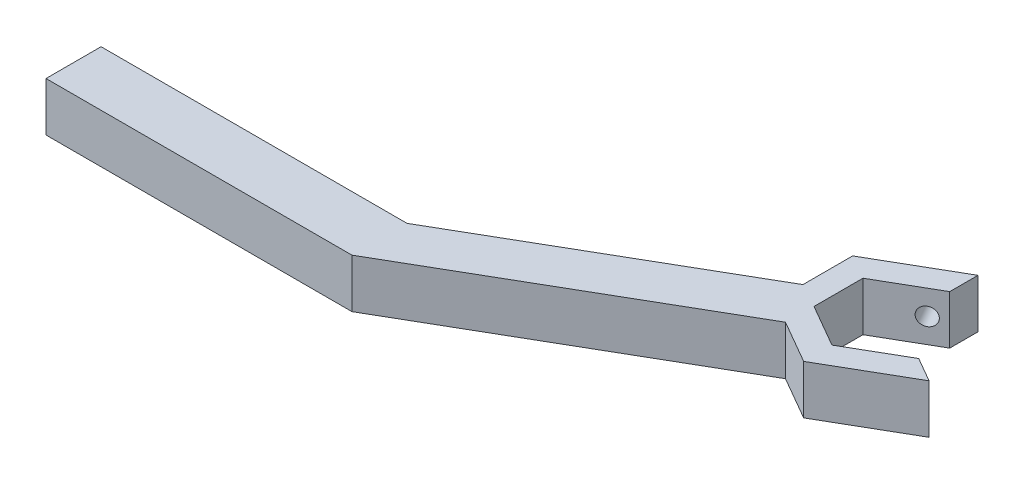
ISO-10303-21;
HEADER;
FILE_DESCRIPTION(('STEP AP214'),'2;1');
FILE_NAME('part.step','',(''),(''),'','','');
FILE_SCHEMA(('AUTOMOTIVE_DESIGN { 1 0 10303 214 1 1 1 1 }'));
ENDSEC;
DATA;
#1=APPLICATION_CONTEXT('core data for automotive mechanical design processes');
#2=APPLICATION_PROTOCOL_DEFINITION('international standard','automotive_design',2000,#1);
#3=PRODUCT_CONTEXT('',#1,'mechanical');
#4=PRODUCT('Part','Part','',(#3));
#5=PRODUCT_RELATED_PRODUCT_CATEGORY('part','',(#4));
#6=PRODUCT_DEFINITION_FORMATION('','',#4);
#7=PRODUCT_DEFINITION_CONTEXT('part definition',#1,'design');
#8=PRODUCT_DEFINITION('design','',#6,#7);
#9=PRODUCT_DEFINITION_SHAPE('','',#8);
#10=(LENGTH_UNIT() NAMED_UNIT(*) SI_UNIT(.MILLI.,.METRE.));
#11=(NAMED_UNIT(*) PLANE_ANGLE_UNIT() SI_UNIT($,.RADIAN.));
#12=(NAMED_UNIT(*) SI_UNIT($,.STERADIAN.) SOLID_ANGLE_UNIT());
#13=UNCERTAINTY_MEASURE_WITH_UNIT(LENGTH_MEASURE(1.E-05),#10,'distance_accuracy_value','');
#14=(GEOMETRIC_REPRESENTATION_CONTEXT(3) GLOBAL_UNCERTAINTY_ASSIGNED_CONTEXT((#13)) GLOBAL_UNIT_ASSIGNED_CONTEXT((#10,
#11,#12)) REPRESENTATION_CONTEXT('',''));
#15=CARTESIAN_POINT('',(0.,0.,0.));
#16=DIRECTION('',(0.,0.,1.));
#17=DIRECTION('',(1.,0.,0.));
#18=AXIS2_PLACEMENT_3D('',#15,#16,#17);
#19=CARTESIAN_POINT('',(5.91089838486212,4.,10.2379763209581));
#20=DIRECTION('',(-0.499999999999996,0.,-0.866025403784441));
#21=DIRECTION('',(-0.866025403784441,0.,0.499999999999996));
#22=AXIS2_PLACEMENT_3D('',#19,#20,#21);
#23=PLANE('',#22);
#24=CARTESIAN_POINT('',(95.1806079660839,4.,-41.3019145362394));
#25=DIRECTION('',(-0.499999999999996,0.,-0.866025403784441));
#26=DIRECTION('',(-0.866025403784441,0.,0.499999999999996));
#27=AXIS2_PLACEMENT_3D('',#24,#25,#26);
#28=CIRCLE('',#27,1.45);
#29=CARTESIAN_POINT('',(93.9248711305965,4.,-40.5769145362394));
#30=VERTEX_POINT('',#29);
#31=EDGE_CURVE('E177',#30,#30,#28,.T.);
#32=ORIENTED_EDGE('',*,*,#31,.F.);
#33=EDGE_LOOP('',(#32));
#34=FACE_BOUND('',#33,.T.);
#35=DIRECTION('',(0.866025403784441,0.,-0.499999999999996));
#36=VECTOR('',#35,1.);
#37=CARTESIAN_POINT('',(5.91089838486212,0.,10.2379763209581));
#38=LINE('',#37,#36);
#39=CARTESIAN_POINT('',(86.5203539282395,0.,-36.3019145362394));
#40=VERTEX_POINT('',#39);
#41=CARTESIAN_POINT('',(99.5107349850061,0.,-43.8019145362394));
#42=VERTEX_POINT('',#41);
#43=EDGE_CURVE('E232',#40,#42,#38,.T.);
#44=ORIENTED_EDGE('',*,*,#43,.F.);
#45=DIRECTION('',(0.,-1.,0.));
#46=VECTOR('',#45,1.);
#47=CARTESIAN_POINT('',(86.5203539282395,4.,-36.3019145362394));
#48=LINE('',#47,#46);
#49=CARTESIAN_POINT('',(86.5203539282395,8.,-36.3019145362394));
#50=VERTEX_POINT('',#49);
#51=EDGE_CURVE('E11',#50,#40,#48,.T.);
#52=ORIENTED_EDGE('',*,*,#51,.F.);
#53=DIRECTION('',(-0.866025403784441,0.,0.499999999999996));
#54=VECTOR('',#53,1.);
#55=CARTESIAN_POINT('',(5.91089838486212,8.,10.2379763209581));
#56=LINE('',#55,#54);
#57=CARTESIAN_POINT('',(99.5107349850061,8.,-43.8019145362394));
#58=VERTEX_POINT('',#57);
#59=EDGE_CURVE('E160',#58,#50,#56,.T.);
#60=ORIENTED_EDGE('',*,*,#59,.F.);
#61=DIRECTION('',(0.,-1.,0.));
#62=VECTOR('',#61,1.);
#63=CARTESIAN_POINT('',(99.5107349850061,4.,-43.8019145362394));
#64=LINE('',#63,#62);
#65=EDGE_CURVE('E61',#58,#42,#64,.T.);
#66=ORIENTED_EDGE('',*,*,#65,.T.);
#67=EDGE_LOOP('',(#44,#52,#60,#66));
#68=FACE_BOUND('',#67,.T.);
#69=ADVANCED_FACE('F46',(#34,#68),#23,.T.);
#70=CARTESIAN_POINT('',(86.5203539282393,4.,4.75762714347043E-13));
#71=DIRECTION('',(1.,0.,0.));
#72=DIRECTION('',(0.,0.,-1.));
#73=AXIS2_PLACEMENT_3D('',#70,#71,#72);
#74=PLANE('',#73);
#75=DIRECTION('',(0.,0.,1.));
#76=VECTOR('',#75,1.);
#77=CARTESIAN_POINT('',(86.5203539282393,0.,4.75762714347043E-13));
#78=LINE('',#77,#76);
#79=CARTESIAN_POINT('',(86.5203539282395,0.,-28.1831123827225));
#80=VERTEX_POINT('',#79);
#81=EDGE_CURVE('E235',#40,#80,#78,.T.);
#82=ORIENTED_EDGE('',*,*,#81,.T.);
#83=DIRECTION('',(0.,-1.,0.));
#84=VECTOR('',#83,1.);
#85=CARTESIAN_POINT('',(86.5203539282395,4.,-28.1831123827225));
#86=LINE('',#85,#84);
#87=CARTESIAN_POINT('',(86.5203539282395,8.,-28.1831123827225));
#88=VERTEX_POINT('',#87);
#89=EDGE_CURVE('E54',#88,#80,#86,.T.);
#90=ORIENTED_EDGE('',*,*,#89,.F.);
#91=DIRECTION('',(0.,0.,-1.));
#92=VECTOR('',#91,1.);
#93=CARTESIAN_POINT('',(86.5203539282393,8.,4.75762714347043E-13));
#94=LINE('',#93,#92);
#95=EDGE_CURVE('E165',#88,#50,#94,.T.);
#96=ORIENTED_EDGE('',*,*,#95,.T.);
#97=ORIENTED_EDGE('',*,*,#51,.T.);
#98=EDGE_LOOP('',(#82,#90,#96,#97));
#99=FACE_BOUND('',#98,.T.);
#100=ADVANCED_FACE('F342',(#99),#74,.F.);
#101=CARTESIAN_POINT('',(9.42644284148479,4.,16.3270779360958));
#102=DIRECTION('',(0.499999999999995,0.,0.866025403784442));
#103=DIRECTION('',(0.866025403784442,0.,-0.499999999999995));
#104=AXIS2_PLACEMENT_3D('',#101,#102,#103);
#105=PLANE('',#104);
#106=DIRECTION('',(-0.866025403784442,0.,0.499999999999995));
#107=VECTOR('',#106,1.);
#108=CARTESIAN_POINT('',(9.42644284148479,0.,16.3270779360958));
#109=LINE('',#108,#107);
#110=CARTESIAN_POINT('',(45.5,0.,-4.5));
#111=VERTEX_POINT('',#110);
#112=EDGE_CURVE('E238',#80,#111,#109,.T.);
#113=ORIENTED_EDGE('',*,*,#112,.T.);
#114=DIRECTION('',(0.,-1.,0.));
#115=VECTOR('',#114,1.);
#116=CARTESIAN_POINT('',(45.5,4.,-4.5));
#117=LINE('',#116,#115);
#118=CARTESIAN_POINT('',(45.5,8.,-4.5));
#119=VERTEX_POINT('',#118);
#120=EDGE_CURVE('E323',#119,#111,#117,.T.);
#121=ORIENTED_EDGE('',*,*,#120,.F.);
#122=DIRECTION('',(0.866025403784442,0.,-0.499999999999995));
#123=VECTOR('',#122,1.);
#124=CARTESIAN_POINT('',(9.42644284148479,8.,16.3270779360958));
#125=LINE('',#124,#123);
#126=EDGE_CURVE('E183',#119,#88,#125,.T.);
#127=ORIENTED_EDGE('',*,*,#126,.T.);
#128=ORIENTED_EDGE('',*,*,#89,.T.);
#129=EDGE_LOOP('',(#113,#121,#127,#128));
#130=FACE_BOUND('',#129,.T.);
#131=ADVANCED_FACE('F329',(#130),#105,.F.);
#132=CARTESIAN_POINT('',(0.,4.,-4.5));
#133=DIRECTION('',(0.,0.,-1.));
#134=DIRECTION('',(-1.,0.,0.));
#135=AXIS2_PLACEMENT_3D('',#132,#133,#134);
#136=PLANE('',#135);
#137=DIRECTION('',(1.,0.,0.));
#138=VECTOR('',#137,1.);
#139=CARTESIAN_POINT('',(0.,0.,-4.5));
#140=LINE('',#139,#138);
#141=CARTESIAN_POINT('',(-4.5,0.,-4.5));
#142=VERTEX_POINT('',#141);
#143=EDGE_CURVE('E242',#142,#111,#140,.T.);
#144=ORIENTED_EDGE('',*,*,#143,.F.);
#145=DIRECTION('',(0.,-1.,0.));
#146=VECTOR('',#145,1.);
#147=CARTESIAN_POINT('',(-4.5,4.,-4.5));
#148=LINE('',#147,#146);
#149=CARTESIAN_POINT('',(-4.5,8.,-4.5));
#150=VERTEX_POINT('',#149);
#151=EDGE_CURVE('E320',#150,#142,#148,.T.);
#152=ORIENTED_EDGE('',*,*,#151,.F.);
#153=DIRECTION('',(-1.,0.,0.));
#154=VECTOR('',#153,1.);
#155=CARTESIAN_POINT('',(0.,8.,-4.5));
#156=LINE('',#155,#154);
#157=EDGE_CURVE('E187',#119,#150,#156,.T.);
#158=ORIENTED_EDGE('',*,*,#157,.F.);
#159=ORIENTED_EDGE('',*,*,#120,.T.);
#160=EDGE_LOOP('',(#144,#152,#158,#159));
#161=FACE_BOUND('',#160,.T.);
#162=ADVANCED_FACE('F339',(#161),#136,.T.);
#163=CARTESIAN_POINT('',(-4.5,4.,0.));
#164=DIRECTION('',(-1.,0.,0.));
#165=DIRECTION('',(0.,0.,1.));
#166=AXIS2_PLACEMENT_3D('',#163,#164,#165);
#167=PLANE('',#166);
#168=DIRECTION('',(0.,0.,-1.));
#169=VECTOR('',#168,1.);
#170=CARTESIAN_POINT('',(-4.5,0.,0.));
#171=LINE('',#170,#169);
#172=CARTESIAN_POINT('',(-4.5,0.,4.5));
#173=VERTEX_POINT('',#172);
#174=EDGE_CURVE('E246',#173,#142,#171,.T.);
#175=ORIENTED_EDGE('',*,*,#174,.F.);
#176=DIRECTION('',(0.,-1.,0.));
#177=VECTOR('',#176,1.);
#178=CARTESIAN_POINT('',(-4.5,4.,4.5));
#179=LINE('',#178,#177);
#180=CARTESIAN_POINT('',(-4.5,8.,4.5));
#181=VERTEX_POINT('',#180);
#182=EDGE_CURVE('E317',#181,#173,#179,.T.);
#183=ORIENTED_EDGE('',*,*,#182,.F.);
#184=DIRECTION('',(0.,0.,1.));
#185=VECTOR('',#184,1.);
#186=CARTESIAN_POINT('',(-4.5,8.,0.));
#187=LINE('',#186,#185);
#188=EDGE_CURVE('E191',#150,#181,#187,.T.);
#189=ORIENTED_EDGE('',*,*,#188,.F.);
#190=ORIENTED_EDGE('',*,*,#151,.T.);
#191=EDGE_LOOP('',(#175,#183,#189,#190));
#192=FACE_BOUND('',#191,.T.);
#193=ADVANCED_FACE('F354',(#192),#167,.T.);
#194=CARTESIAN_POINT('',(0.,4.,4.5));
#195=DIRECTION('',(0.,0.,1.));
#196=DIRECTION('',(1.,0.,0.));
#197=AXIS2_PLACEMENT_3D('',#194,#195,#196);
#198=PLANE('',#197);
#199=DIRECTION('',(-1.,0.,0.));
#200=VECTOR('',#199,1.);
#201=CARTESIAN_POINT('',(0.,0.,4.5));
#202=LINE('',#201,#200);
#203=CARTESIAN_POINT('',(45.5,0.,4.5));
#204=VERTEX_POINT('',#203);
#205=EDGE_CURVE('E250',#204,#173,#202,.T.);
#206=ORIENTED_EDGE('',*,*,#205,.F.);
#207=DIRECTION('',(0.,-1.,0.));
#208=VECTOR('',#207,1.);
#209=CARTESIAN_POINT('',(45.5,4.,4.5));
#210=LINE('',#209,#208);
#211=CARTESIAN_POINT('',(45.5,8.,4.5));
#212=VERTEX_POINT('',#211);
#213=EDGE_CURVE('E314',#212,#204,#210,.T.);
#214=ORIENTED_EDGE('',*,*,#213,.F.);
#215=DIRECTION('',(1.,0.,0.));
#216=VECTOR('',#215,1.);
#217=CARTESIAN_POINT('',(0.,8.,4.5));
#218=LINE('',#217,#216);
#219=EDGE_CURVE('E195',#181,#212,#218,.T.);
#220=ORIENTED_EDGE('',*,*,#219,.F.);
#221=ORIENTED_EDGE('',*,*,#182,.T.);
#222=EDGE_LOOP('',(#206,#214,#220,#221));
#223=FACE_BOUND('',#222,.T.);
#224=ADVANCED_FACE('F357',(#223),#198,.T.);
#225=CARTESIAN_POINT('',(13.3235571585147,4.,23.0770779360959));
#226=DIRECTION('',(-0.499999999999995,0.,-0.866025403784442));
#227=DIRECTION('',(-0.866025403784442,0.,0.499999999999995));
#228=AXIS2_PLACEMENT_3D('',#225,#226,#227);
#229=PLANE('',#228);
#230=DIRECTION('',(0.866025403784442,0.,-0.499999999999995));
#231=VECTOR('',#230,1.);
#232=CARTESIAN_POINT('',(13.3235571585147,0.,23.0770779360959));
#233=LINE('',#232,#231);
#234=CARTESIAN_POINT('',(90.4174682452694,0.,-21.4331123827224));
#235=VERTEX_POINT('',#234);
#236=EDGE_CURVE('E254',#204,#235,#233,.T.);
#237=ORIENTED_EDGE('',*,*,#236,.T.);
#238=DIRECTION('',(0.,-1.,0.));
#239=VECTOR('',#238,1.);
#240=CARTESIAN_POINT('',(90.4174682452694,4.,-21.4331123827224));
#241=LINE('',#240,#239);
#242=CARTESIAN_POINT('',(90.4174682452694,8.,-21.4331123827224));
#243=VERTEX_POINT('',#242);
#244=EDGE_CURVE('E310',#243,#235,#241,.T.);
#245=ORIENTED_EDGE('',*,*,#244,.F.);
#246=DIRECTION('',(-0.866025403784442,0.,0.499999999999995));
#247=VECTOR('',#246,1.);
#248=CARTESIAN_POINT('',(13.3235571585147,8.,23.0770779360959));
#249=LINE('',#248,#247);
#250=EDGE_CURVE('E199',#243,#212,#249,.T.);
#251=ORIENTED_EDGE('',*,*,#250,.T.);
#252=ORIENTED_EDGE('',*,*,#213,.T.);
#253=EDGE_LOOP('',(#237,#245,#251,#252));
#254=FACE_BOUND('',#253,.T.);
#255=ADVANCED_FACE('F361',(#254),#229,.F.);
#256=CARTESIAN_POINT('',(31.88517696412,4.,-55.22674651018));
#257=DIRECTION('',(0.500000000000004,0.,-0.866025403784436));
#258=DIRECTION('',(-0.866025403784436,0.,-0.500000000000004));
#259=AXIS2_PLACEMENT_3D('',#256,#257,#258);
#260=PLANE('',#259);
#261=DIRECTION('',(0.866025403784436,0.,0.500000000000004));
#262=VECTOR('',#261,1.);
#263=CARTESIAN_POINT('',(31.88517696412,0.,-55.22674651018));
#264=LINE('',#263,#262);
#265=CARTESIAN_POINT('',(97.4485571585149,0.,-17.3737113059639));
#266=VERTEX_POINT('',#265);
#267=EDGE_CURVE('E257',#235,#266,#264,.T.);
#268=ORIENTED_EDGE('',*,*,#267,.T.);
#269=DIRECTION('',(0.,-1.,0.));
#270=VECTOR('',#269,1.);
#271=CARTESIAN_POINT('',(97.4485571585149,4.,-17.3737113059639));
#272=LINE('',#271,#270);
#273=CARTESIAN_POINT('',(97.4485571585149,8.,-17.3737113059639));
#274=VERTEX_POINT('',#273);
#275=EDGE_CURVE('E306',#274,#266,#272,.T.);
#276=ORIENTED_EDGE('',*,*,#275,.F.);
#277=DIRECTION('',(-0.866025403784436,0.,-0.500000000000004));
#278=VECTOR('',#277,1.);
#279=CARTESIAN_POINT('',(31.88517696412,8.,-55.22674651018));
#280=LINE('',#279,#278);
#281=EDGE_CURVE('E203',#274,#243,#280,.T.);
#282=ORIENTED_EDGE('',*,*,#281,.T.);
#283=ORIENTED_EDGE('',*,*,#244,.T.);
#284=EDGE_LOOP('',(#268,#276,#282,#283));
#285=FACE_BOUND('',#284,.T.);
#286=ADVANCED_FACE('F365',(#285),#260,.F.);
#287=CARTESIAN_POINT('',(16.8391016151374,4.,29.1661795512336));
#288=DIRECTION('',(-0.499999999999994,0.,-0.866025403784442));
#289=DIRECTION('',(-0.866025403784442,0.,0.499999999999994));
#290=AXIS2_PLACEMENT_3D('',#287,#288,#289);
#291=PLANE('',#290);
#292=DIRECTION('',(0.866025403784442,0.,-0.499999999999994));
#293=VECTOR('',#292,1.);
#294=CARTESIAN_POINT('',(16.8391016151374,0.,29.1661795512336));
#295=LINE('',#294,#293);
#296=CARTESIAN_POINT('',(110.438938215282,0.,-24.8737113059638));
#297=VERTEX_POINT('',#296);
#298=EDGE_CURVE('E260',#266,#297,#295,.T.);
#299=ORIENTED_EDGE('',*,*,#298,.T.);
#300=DIRECTION('',(0.,-1.,0.));
#301=VECTOR('',#300,1.);
#302=CARTESIAN_POINT('',(110.438938215282,4.,-24.8737113059638));
#303=LINE('',#302,#301);
#304=CARTESIAN_POINT('',(110.438938215282,8.,-24.8737113059638));
#305=VERTEX_POINT('',#304);
#306=EDGE_CURVE('E302',#305,#297,#303,.T.);
#307=ORIENTED_EDGE('',*,*,#306,.F.);
#308=DIRECTION('',(-0.866025403784442,0.,0.499999999999994));
#309=VECTOR('',#308,1.);
#310=CARTESIAN_POINT('',(16.8391016151374,8.,29.1661795512336));
#311=LINE('',#310,#309);
#312=EDGE_CURVE('E207',#305,#274,#311,.T.);
#313=ORIENTED_EDGE('',*,*,#312,.T.);
#314=ORIENTED_EDGE('',*,*,#275,.T.);
#315=EDGE_LOOP('',(#299,#307,#313,#314));
#316=FACE_BOUND('',#315,.T.);
#317=ADVANCED_FACE('F369',(#316),#291,.F.);
#318=CARTESIAN_POINT('',(38.3803674925035,4.,-66.47674651018));
#319=DIRECTION('',(-0.500000000000005,0.,0.866025403784436));
#320=DIRECTION('',(0.866025403784435,0.,0.500000000000005));
#321=AXIS2_PLACEMENT_3D('',#318,#319,#320);
#322=PLANE('',#321);
#323=DIRECTION('',(-0.866025403784436,0.,-0.500000000000005));
#324=VECTOR('',#323,1.);
#325=CARTESIAN_POINT('',(38.3803674925035,0.,-66.47674651018));
#326=LINE('',#325,#324);
#327=CARTESIAN_POINT('',(106.438938215282,0.,-27.1831123827223));
#328=VERTEX_POINT('',#327);
#329=EDGE_CURVE('E263',#297,#328,#326,.T.);
#330=ORIENTED_EDGE('',*,*,#329,.T.);
#331=DIRECTION('',(0.,-1.,0.));
#332=VECTOR('',#331,1.);
#333=CARTESIAN_POINT('',(106.438938215282,4.,-27.1831123827223));
#334=LINE('',#333,#332);
#335=CARTESIAN_POINT('',(106.438938215282,8.,-27.1831123827223));
#336=VERTEX_POINT('',#335);
#337=EDGE_CURVE('E299',#336,#328,#334,.T.);
#338=ORIENTED_EDGE('',*,*,#337,.F.);
#339=DIRECTION('',(0.866025403784436,0.,0.500000000000005));
#340=VECTOR('',#339,1.);
#341=CARTESIAN_POINT('',(38.3803674925035,8.,-66.47674651018));
#342=LINE('',#341,#340);
#343=EDGE_CURVE('E211',#336,#305,#342,.T.);
#344=ORIENTED_EDGE('',*,*,#343,.T.);
#345=ORIENTED_EDGE('',*,*,#306,.T.);
#346=EDGE_LOOP('',(#330,#338,#344,#345));
#347=FACE_BOUND('',#346,.T.);
#348=ADVANCED_FACE('F373',(#347),#322,.F.);
#349=CARTESIAN_POINT('',(14.8391016151373,4.,25.7020779360957));
#350=DIRECTION('',(-0.499999999999993,0.,-0.866025403784442));
#351=DIRECTION('',(-0.866025403784442,0.,0.499999999999993));
#352=AXIS2_PLACEMENT_3D('',#349,#350,#351);
#353=PLANE('',#352);
#354=DIRECTION('',(0.866025403784442,0.,-0.499999999999993));
#355=VECTOR('',#354,1.);
#356=CARTESIAN_POINT('',(14.8391016151373,0.,25.7020779360957));
#357=LINE('',#356,#355);
#358=CARTESIAN_POINT('',(97.4485571585149,0.,-21.9925134594809));
#359=VERTEX_POINT('',#358);
#360=EDGE_CURVE('E267',#359,#328,#357,.T.);
#361=ORIENTED_EDGE('',*,*,#360,.F.);
#362=DIRECTION('',(0.,-1.,0.));
#363=VECTOR('',#362,1.);
#364=CARTESIAN_POINT('',(97.4485571585149,4.,-21.9925134594809));
#365=LINE('',#364,#363);
#366=CARTESIAN_POINT('',(97.4485571585149,8.,-21.9925134594809));
#367=VERTEX_POINT('',#366);
#368=EDGE_CURVE('E296',#367,#359,#365,.T.);
#369=ORIENTED_EDGE('',*,*,#368,.F.);
#370=DIRECTION('',(-0.866025403784442,0.,0.499999999999993));
#371=VECTOR('',#370,1.);
#372=CARTESIAN_POINT('',(14.8391016151373,8.,25.7020779360957));
#373=LINE('',#372,#371);
#374=EDGE_CURVE('E215',#336,#367,#373,.T.);
#375=ORIENTED_EDGE('',*,*,#374,.F.);
#376=ORIENTED_EDGE('',*,*,#337,.T.);
#377=EDGE_LOOP('',(#361,#369,#375,#376));
#378=FACE_BOUND('',#377,.T.);
#379=ADVANCED_FACE('F377',(#378),#353,.T.);
#380=CARTESIAN_POINT('',(33.88517696412,4.,-58.6908481253177));
#381=DIRECTION('',(0.500000000000004,0.,-0.866025403784436));
#382=DIRECTION('',(-0.866025403784436,0.,-0.500000000000004));
#383=AXIS2_PLACEMENT_3D('',#380,#381,#382);
#384=PLANE('',#383);
#385=DIRECTION('',(0.866025403784436,0.,0.500000000000004));
#386=VECTOR('',#385,1.);
#387=CARTESIAN_POINT('',(33.88517696412,0.,-58.6908481253177));
#388=LINE('',#387,#386);
#389=CARTESIAN_POINT('',(90.5203539282395,0.,-25.9925134594809));
#390=VERTEX_POINT('',#389);
#391=EDGE_CURVE('E271',#390,#359,#388,.T.);
#392=ORIENTED_EDGE('',*,*,#391,.F.);
#393=DIRECTION('',(0.,-1.,0.));
#394=VECTOR('',#393,1.);
#395=CARTESIAN_POINT('',(90.5203539282395,4.,-25.9925134594809));
#396=LINE('',#395,#394);
#397=CARTESIAN_POINT('',(90.5203539282395,8.,-25.9925134594809));
#398=VERTEX_POINT('',#397);
#399=EDGE_CURVE('E293',#398,#390,#396,.T.);
#400=ORIENTED_EDGE('',*,*,#399,.F.);
#401=DIRECTION('',(-0.866025403784436,0.,-0.500000000000004));
#402=VECTOR('',#401,1.);
#403=CARTESIAN_POINT('',(33.88517696412,8.,-58.6908481253177));
#404=LINE('',#403,#402);
#405=EDGE_CURVE('E219',#367,#398,#404,.T.);
#406=ORIENTED_EDGE('',*,*,#405,.F.);
#407=ORIENTED_EDGE('',*,*,#368,.T.);
#408=EDGE_LOOP('',(#392,#400,#406,#407));
#409=FACE_BOUND('',#408,.T.);
#410=ADVANCED_FACE('F381',(#409),#384,.T.);
#411=CARTESIAN_POINT('',(90.5203539282393,4.,4.71083349039138E-13));
#412=DIRECTION('',(1.,0.,0.));
#413=DIRECTION('',(0.,0.,-1.));
#414=AXIS2_PLACEMENT_3D('',#411,#412,#413);
#415=PLANE('',#414);
#416=DIRECTION('',(0.,0.,1.));
#417=VECTOR('',#416,1.);
#418=CARTESIAN_POINT('',(90.5203539282393,0.,4.71083349039138E-13));
#419=LINE('',#418,#417);
#420=CARTESIAN_POINT('',(90.5203539282395,0.,-33.9925134594809));
#421=VERTEX_POINT('',#420);
#422=EDGE_CURVE('E275',#421,#390,#419,.T.);
#423=ORIENTED_EDGE('',*,*,#422,.F.);
#424=DIRECTION('',(0.,-1.,0.));
#425=VECTOR('',#424,1.);
#426=CARTESIAN_POINT('',(90.5203539282395,4.,-33.9925134594809));
#427=LINE('',#426,#425);
#428=CARTESIAN_POINT('',(90.5203539282395,8.,-33.9925134594809));
#429=VERTEX_POINT('',#428);
#430=EDGE_CURVE('E290',#429,#421,#427,.T.);
#431=ORIENTED_EDGE('',*,*,#430,.F.);
#432=DIRECTION('',(0.,0.,-1.));
#433=VECTOR('',#432,1.);
#434=CARTESIAN_POINT('',(90.5203539282393,8.,4.71083349039138E-13));
#435=LINE('',#434,#433);
#436=EDGE_CURVE('E223',#398,#429,#435,.T.);
#437=ORIENTED_EDGE('',*,*,#436,.F.);
#438=ORIENTED_EDGE('',*,*,#399,.T.);
#439=EDGE_LOOP('',(#423,#431,#437,#438));
#440=FACE_BOUND('',#439,.T.);
#441=ADVANCED_FACE('F385',(#440),#415,.T.);
#442=CARTESIAN_POINT('',(7.91089838486209,4.,13.7020779360959));
#443=DIRECTION('',(0.499999999999996,0.,0.866025403784441));
#444=DIRECTION('',(0.866025403784441,0.,-0.499999999999996));
#445=AXIS2_PLACEMENT_3D('',#442,#443,#444);
#446=PLANE('',#445);
#447=CARTESIAN_POINT('',(97.1806079660839,4.,-37.8378129211016));
#448=DIRECTION('',(0.499999999999996,0.,0.866025403784441));
#449=DIRECTION('',(0.866025403784441,0.,-0.499999999999996));
#450=AXIS2_PLACEMENT_3D('',#447,#448,#449);
#451=CIRCLE('',#450,1.45);
#452=CARTESIAN_POINT('',(98.4363448015713,4.,-38.5628129211016));
#453=VERTEX_POINT('',#452);
#454=EDGE_CURVE('E173',#453,#453,#451,.F.);
#455=ORIENTED_EDGE('',*,*,#454,.T.);
#456=EDGE_LOOP('',(#455));
#457=FACE_BOUND('',#456,.T.);
#458=DIRECTION('',(-0.866025403784441,0.,0.499999999999996));
#459=VECTOR('',#458,1.);
#460=CARTESIAN_POINT('',(7.91089838486209,0.,13.7020779360959));
#461=LINE('',#460,#459);
#462=CARTESIAN_POINT('',(99.5107349850061,0.,-39.1831123827224));
#463=VERTEX_POINT('',#462);
#464=EDGE_CURVE('E279',#463,#421,#461,.T.);
#465=ORIENTED_EDGE('',*,*,#464,.F.);
#466=DIRECTION('',(0.,-1.,0.));
#467=VECTOR('',#466,1.);
#468=CARTESIAN_POINT('',(99.5107349850061,4.,-39.1831123827224));
#469=LINE('',#468,#467);
#470=CARTESIAN_POINT('',(99.5107349850061,8.,-39.1831123827224));
#471=VERTEX_POINT('',#470);
#472=EDGE_CURVE('E69',#471,#463,#469,.T.);
#473=ORIENTED_EDGE('',*,*,#472,.F.);
#474=DIRECTION('',(0.866025403784441,0.,-0.499999999999996));
#475=VECTOR('',#474,1.);
#476=CARTESIAN_POINT('',(7.91089838486209,8.,13.7020779360959));
#477=LINE('',#476,#475);
#478=EDGE_CURVE('E171',#429,#471,#477,.T.);
#479=ORIENTED_EDGE('',*,*,#478,.F.);
#480=ORIENTED_EDGE('',*,*,#430,.T.);
#481=EDGE_LOOP('',(#465,#473,#479,#480));
#482=FACE_BOUND('',#481,.T.);
#483=ADVANCED_FACE('F389',(#457,#482),#446,.T.);
#484=CARTESIAN_POINT('',(99.510734985006,4.,2.98992859798079E-13));
#485=DIRECTION('',(1.,0.,0.));
#486=DIRECTION('',(0.,0.,-1.));
#487=AXIS2_PLACEMENT_3D('',#484,#485,#486);
#488=PLANE('',#487);
#489=DIRECTION('',(0.,0.,1.));
#490=VECTOR('',#489,1.);
#491=CARTESIAN_POINT('',(99.510734985006,0.,2.98992859798079E-13));
#492=LINE('',#491,#490);
#493=EDGE_CURVE('E155',#42,#463,#492,.T.);
#494=ORIENTED_EDGE('',*,*,#493,.F.);
#495=ORIENTED_EDGE('',*,*,#65,.F.);
#496=DIRECTION('',(0.,0.,-1.));
#497=VECTOR('',#496,1.);
#498=CARTESIAN_POINT('',(99.510734985006,8.,2.98992859798079E-13));
#499=LINE('',#498,#497);
#500=EDGE_CURVE('E153',#471,#58,#499,.T.);
#501=ORIENTED_EDGE('',*,*,#500,.F.);
#502=ORIENTED_EDGE('',*,*,#472,.T.);
#503=EDGE_LOOP('',(#494,#495,#501,#502));
#504=FACE_BOUND('',#503,.T.);
#505=ADVANCED_FACE('F151',(#504),#488,.T.);
#506=CARTESIAN_POINT('',(0.,4.,0.));
#507=DIRECTION('',(0.,-1.,0.));
#508=DIRECTION('',(0.,0.,-1.));
#509=AXIS2_PLACEMENT_3D('',#506,#507,#508);
#510=CYLINDRICAL_SURFACE('',#509,2.5);
#511=CARTESIAN_POINT('',(0.,4.,0.));
#512=DIRECTION('',(0.,1.,0.));
#513=DIRECTION('',(0.,0.,1.));
#514=AXIS2_PLACEMENT_3D('',#511,#512,#513);
#515=CIRCLE('',#514,2.5);
#516=CARTESIAN_POINT('',(0.,4.,2.5));
#517=VERTEX_POINT('',#516);
#518=EDGE_CURVE('E228',#517,#517,#515,.T.);
#519=ORIENTED_EDGE('',*,*,#518,.T.);
#520=EDGE_LOOP('',(#519));
#521=FACE_BOUND('',#520,.T.);
#522=CARTESIAN_POINT('',(0.,0.,0.));
#523=DIRECTION('',(0.,1.,0.));
#524=DIRECTION('',(0.,0.,1.));
#525=AXIS2_PLACEMENT_3D('',#522,#523,#524);
#526=CIRCLE('',#525,2.5);
#527=CARTESIAN_POINT('',(0.,0.,2.5));
#528=VERTEX_POINT('',#527);
#529=EDGE_CURVE('E157',#528,#528,#526,.T.);
#530=ORIENTED_EDGE('',*,*,#529,.F.);
#531=EDGE_LOOP('',(#530));
#532=FACE_BOUND('',#531,.T.);
#533=ADVANCED_FACE('F396',(#521,#532),#510,.F.);
#534=CARTESIAN_POINT('',(0.,0.,0.));
#535=DIRECTION('',(0.,1.,0.));
#536=DIRECTION('',(0.,0.,1.));
#537=AXIS2_PLACEMENT_3D('',#534,#535,#536);
#538=PLANE('',#537);
#539=ORIENTED_EDGE('',*,*,#43,.T.);
#540=ORIENTED_EDGE('',*,*,#493,.T.);
#541=ORIENTED_EDGE('',*,*,#464,.T.);
#542=ORIENTED_EDGE('',*,*,#422,.T.);
#543=ORIENTED_EDGE('',*,*,#391,.T.);
#544=ORIENTED_EDGE('',*,*,#360,.T.);
#545=ORIENTED_EDGE('',*,*,#329,.F.);
#546=ORIENTED_EDGE('',*,*,#298,.F.);
#547=ORIENTED_EDGE('',*,*,#267,.F.);
#548=ORIENTED_EDGE('',*,*,#236,.F.);
#549=ORIENTED_EDGE('',*,*,#205,.T.);
#550=ORIENTED_EDGE('',*,*,#174,.T.);
#551=ORIENTED_EDGE('',*,*,#143,.T.);
#552=ORIENTED_EDGE('',*,*,#112,.F.);
#553=ORIENTED_EDGE('',*,*,#81,.F.);
#554=EDGE_LOOP('',(#539,#540,#541,#542,#543,#544,#545,#546,#547,#548,#549,#550,#551,#552,#553));
#555=FACE_BOUND('',#554,.T.);
#556=ORIENTED_EDGE('',*,*,#529,.T.);
#557=EDGE_LOOP('',(#556));
#558=FACE_BOUND('',#557,.T.);
#559=ADVANCED_FACE('F334',(#555,#558),#538,.F.);
#560=CARTESIAN_POINT('',(0.,4.,0.));
#561=DIRECTION('',(0.,1.,0.));
#562=DIRECTION('',(0.,0.,1.));
#563=AXIS2_PLACEMENT_3D('',#560,#561,#562);
#564=PLANE('',#563);
#565=ORIENTED_EDGE('',*,*,#518,.F.);
#566=EDGE_LOOP('',(#565));
#567=FACE_BOUND('',#566,.T.);
#568=ADVANCED_FACE('F401',(#567),#564,.F.);
#569=CARTESIAN_POINT('',(0.,8.,0.));
#570=DIRECTION('',(0.,1.,0.));
#571=DIRECTION('',(0.,0.,1.));
#572=AXIS2_PLACEMENT_3D('',#569,#570,#571);
#573=PLANE('',#572);
#574=ORIENTED_EDGE('',*,*,#500,.T.);
#575=ORIENTED_EDGE('',*,*,#59,.T.);
#576=ORIENTED_EDGE('',*,*,#95,.F.);
#577=ORIENTED_EDGE('',*,*,#126,.F.);
#578=ORIENTED_EDGE('',*,*,#157,.T.);
#579=ORIENTED_EDGE('',*,*,#188,.T.);
#580=ORIENTED_EDGE('',*,*,#219,.T.);
#581=ORIENTED_EDGE('',*,*,#250,.F.);
#582=ORIENTED_EDGE('',*,*,#281,.F.);
#583=ORIENTED_EDGE('',*,*,#312,.F.);
#584=ORIENTED_EDGE('',*,*,#343,.F.);
#585=ORIENTED_EDGE('',*,*,#374,.T.);
#586=ORIENTED_EDGE('',*,*,#405,.T.);
#587=ORIENTED_EDGE('',*,*,#436,.T.);
#588=ORIENTED_EDGE('',*,*,#478,.T.);
#589=EDGE_LOOP('',(#574,#575,#576,#577,#578,#579,#580,#581,#582,#583,#584,#585,#586,#587,#588));
#590=FACE_BOUND('',#589,.T.);
#591=ADVANCED_FACE('F168',(#590),#573,.T.);
#592=CARTESIAN_POINT('',(99.2312176315249,4.,-34.286052794066));
#593=DIRECTION('',(-0.499999999999996,0.,-0.866025403784441));
#594=DIRECTION('',(-0.866025403784441,0.,0.499999999999996));
#595=AXIS2_PLACEMENT_3D('',#592,#593,#594);
#596=CYLINDRICAL_SURFACE('',#595,1.45);
#597=ORIENTED_EDGE('',*,*,#31,.T.);
#598=EDGE_LOOP('',(#597));
#599=FACE_BOUND('',#598,.T.);
#600=ORIENTED_EDGE('',*,*,#454,.F.);
#601=EDGE_LOOP('',(#600));
#602=FACE_BOUND('',#601,.T.);
#603=ADVANCED_FACE('F407',(#599,#602),#596,.F.);
#604=CLOSED_SHELL('',(#69,#100,#131,#162,#193,#224,#255,#286,#317,#348,#379,#410,#441,#483,#505,
#533,#559,#568,#591,#603));
#605=MANIFOLD_SOLID_BREP('B2',#604);
#606=ADVANCED_BREP_SHAPE_REPRESENTATION('',(#18,#605),#14);
#607=SHAPE_DEFINITION_REPRESENTATION(#9,#606);
ENDSEC;
END-ISO-10303-21;
